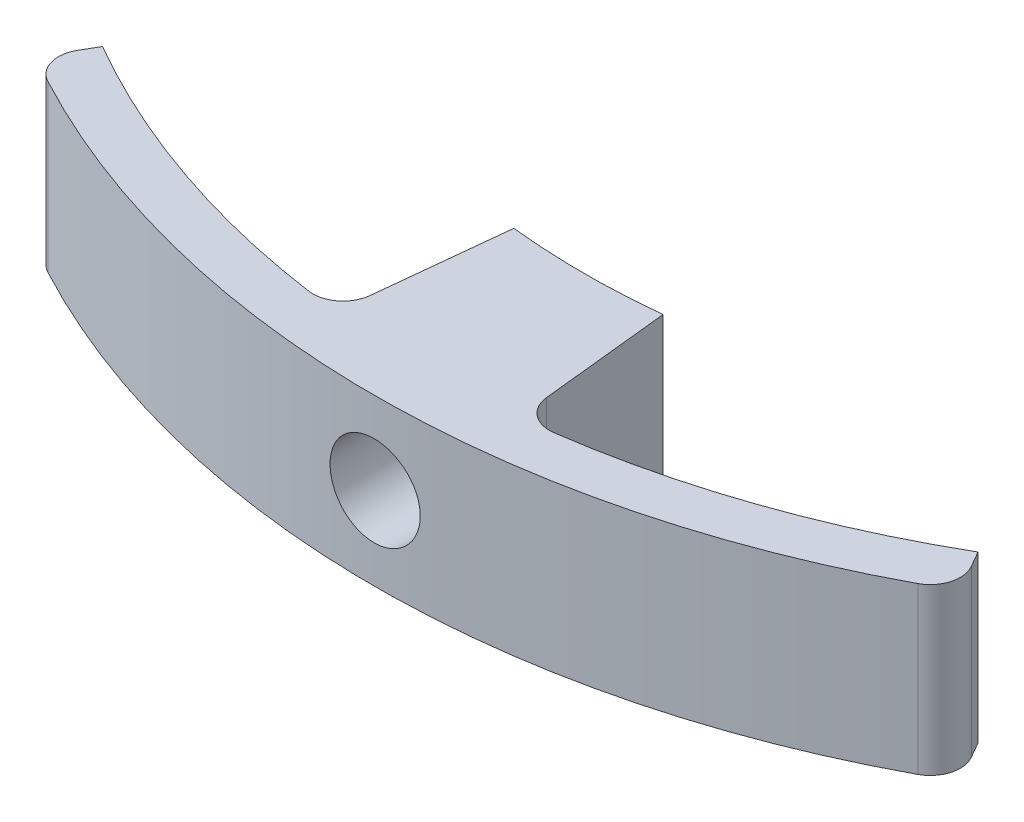
ISO-10303-21;
HEADER;
FILE_DESCRIPTION(('STEP AP214'),'2;1');
FILE_NAME('part.step','',(''),(''),'','','');
FILE_SCHEMA(('AUTOMOTIVE_DESIGN { 1 0 10303 214 1 1 1 1 }'));
ENDSEC;
DATA;
#1=APPLICATION_CONTEXT('core data for automotive mechanical design processes');
#2=APPLICATION_PROTOCOL_DEFINITION('international standard','automotive_design',2000,#1);
#3=PRODUCT_CONTEXT('',#1,'mechanical');
#4=PRODUCT('Part','Part','',(#3));
#5=PRODUCT_RELATED_PRODUCT_CATEGORY('part','',(#4));
#6=PRODUCT_DEFINITION_FORMATION('','',#4);
#7=PRODUCT_DEFINITION_CONTEXT('part definition',#1,'design');
#8=PRODUCT_DEFINITION('design','',#6,#7);
#9=PRODUCT_DEFINITION_SHAPE('','',#8);
#10=(LENGTH_UNIT() NAMED_UNIT(*) SI_UNIT(.MILLI.,.METRE.));
#11=(NAMED_UNIT(*) PLANE_ANGLE_UNIT() SI_UNIT($,.RADIAN.));
#12=(NAMED_UNIT(*) SI_UNIT($,.STERADIAN.) SOLID_ANGLE_UNIT());
#13=UNCERTAINTY_MEASURE_WITH_UNIT(LENGTH_MEASURE(1.E-05),#10,'distance_accuracy_value','');
#14=(GEOMETRIC_REPRESENTATION_CONTEXT(3) GLOBAL_UNCERTAINTY_ASSIGNED_CONTEXT((#13)) GLOBAL_UNIT_ASSIGNED_CONTEXT((#10,
#11,#12)) REPRESENTATION_CONTEXT('',''));
#15=CARTESIAN_POINT('',(0.,0.,0.));
#16=DIRECTION('',(0.,0.,1.));
#17=DIRECTION('',(1.,0.,0.));
#18=AXIS2_PLACEMENT_3D('',#15,#16,#17);
#19=CARTESIAN_POINT('',(13.,72.6735490003773,-57.2516853780901));
#20=DIRECTION('',(0.,-1.,0.));
#21=DIRECTION('',(1.,0.,0.));
#22=AXIS2_PLACEMENT_3D('',#19,#20,#21);
#23=CYLINDRICAL_SURFACE('',#22,47.5);
#24=CARTESIAN_POINT('',(14.5,5.49999999999999,-9.77537549621318));
#25=CARTESIAN_POINT('',(14.4999962715051,5.58423311771971,-9.7753751766498));
#26=CARTESIAN_POINT('',(14.4928809650694,5.66852677775698,-9.7751489167701));
#27=CARTESIAN_POINT('',(14.4645962000676,5.83479106022818,-9.7742681098958));
#28=CARTESIAN_POINT('',(14.4434099675749,5.91675878816941,-9.77361305174495));
#29=CARTESIAN_POINT('',(14.3875884628386,6.07593849288966,-9.77194892658279));
#30=CARTESIAN_POINT('',(14.3529597867884,6.1531527806802,-9.77094003322146));
#31=CARTESIAN_POINT('',(14.2712458769974,6.30065072529808,-9.76868214151818));
#32=CARTESIAN_POINT('',(14.2241636779302,6.37093606485115,-9.76743320169097));
#33=CARTESIAN_POINT('',(14.118852326546,6.50263699315104,-9.76483523385514));
#34=CARTESIAN_POINT('',(14.0606185431732,6.56404887825356,-9.76348616440751));
#35=CARTESIAN_POINT('',(13.9346652902813,6.67622843136156,-9.76084036395221));
#36=CARTESIAN_POINT('',(13.8669454426264,6.72699567484605,-9.75954363503361));
#37=CARTESIAN_POINT('',(13.723927946911,6.81645117120633,-9.75714846642311));
#38=CARTESIAN_POINT('',(13.6486288589682,6.85513712316403,-9.75605006451997));
#39=CARTESIAN_POINT('',(13.4926005960709,6.91931693681816,-9.75417570039046));
#40=CARTESIAN_POINT('',(13.4118714440589,6.94481085424799,-9.75339973680185));
#41=CARTESIAN_POINT('',(13.2473033689426,6.98187473985174,-9.75225794917248));
#42=CARTESIAN_POINT('',(13.1634654999875,6.99344938426308,-9.75189198739275));
#43=CARTESIAN_POINT('',(12.995035961426,7.00236057077915,-9.75161099368585));
#44=CARTESIAN_POINT('',(12.910444295006,6.99969717304268,-9.75169595985342));
#45=CARTESIAN_POINT('',(12.7429400870256,6.98021182124884,-9.75230712678476));
#46=CARTESIAN_POINT('',(12.6600269576975,6.9633949142738,-9.75283317026195));
#47=CARTESIAN_POINT('',(12.4982012561662,6.91608772329586,-9.75426702616968));
#48=CARTESIAN_POINT('',(12.4192886932428,6.88559740757704,-9.75517483948574));
#49=CARTESIAN_POINT('',(12.2676879314009,6.8118031218226,-9.75727019418966));
#50=CARTESIAN_POINT('',(12.1950008586076,6.76849683979978,-9.75845778604138));
#51=CARTESIAN_POINT('',(12.0579267495815,6.67030164670387,-9.76097886514691));
#52=CARTESIAN_POINT('',(11.993539734729,6.61541270579567,-9.76231235277651));
#53=CARTESIAN_POINT('',(11.8748640289177,6.49558172491615,-9.76497563782857));
#54=CARTESIAN_POINT('',(11.8205797598795,6.4306353055162,-9.76630543338536));
#55=CARTESIAN_POINT('',(11.7236845259669,6.29254840559263,-9.76881082630827));
#56=CARTESIAN_POINT('',(11.6810735630688,6.21940792368176,-9.76998642364828));
#57=CARTESIAN_POINT('',(11.6087349911771,6.06700660024199,-9.77205082079395));
#58=CARTESIAN_POINT('',(11.5790075268942,5.98774568997868,-9.77293961737815));
#59=CARTESIAN_POINT('',(11.5332826621532,5.82535457919406,-9.77433006015663));
#60=CARTESIAN_POINT('',(11.517285220272,5.74222439034707,-9.77483170751892));
#61=CARTESIAN_POINT('',(11.4994799388015,5.57449296818837,-9.77539107618823));
#62=CARTESIAN_POINT('',(11.4976659725275,5.48989238585607,-9.77544898917024));
#63=CARTESIAN_POINT('',(11.5082631671122,5.32158789861901,-9.77511485908235));
#64=CARTESIAN_POINT('',(11.5206743096336,5.2378839925585,-9.77472281659248));
#65=CARTESIAN_POINT('',(11.5593643389517,5.07376601905093,-9.77353314471295));
#66=CARTESIAN_POINT('',(11.585640440329,4.99335129431452,-9.77273559678902));
#67=CARTESIAN_POINT('',(11.6513116778774,4.83807418819995,-9.77082488992993));
#68=CARTESIAN_POINT('',(11.690706843469,4.76321181927388,-9.76971173028699));
#69=CARTESIAN_POINT('',(11.7815137068165,4.62113628305716,-9.76729481704044));
#70=CARTESIAN_POINT('',(11.8329295302098,4.55392575377488,-9.76599099805787));
#71=CARTESIAN_POINT('',(11.9463121446472,4.42908826181458,-9.76333997636345));
#72=CARTESIAN_POINT('',(12.008278965077,4.37146132582885,-9.76199277353078));
#73=CARTESIAN_POINT('',(12.1410308020256,4.26740639013537,-9.75940629508915));
#74=CARTESIAN_POINT('',(12.2118189166056,4.2209823418145,-9.75816705765901));
#75=CARTESIAN_POINT('',(12.3601881208689,4.14067801003974,-9.75593674639941));
#76=CARTESIAN_POINT('',(12.4377691943765,4.10679769671715,-9.75494567197904));
#77=CARTESIAN_POINT('',(12.5975071874769,4.05254950139883,-9.75332358763539));
#78=CARTESIAN_POINT('',(12.6796632376058,4.03217906131845,-9.75269250955024));
#79=CARTESIAN_POINT('',(12.8462313853929,4.00552046582288,-9.75186128509193));
#80=CARTESIAN_POINT('',(12.9306434804225,3.99923229400178,-9.75166113821672));
#81=CARTESIAN_POINT('',(13.0992880827844,4.00091702590551,-9.75171433321261));
#82=CARTESIAN_POINT('',(13.1835206524192,4.00888370645148,-9.75196747719252));
#83=CARTESIAN_POINT('',(13.3494520753302,4.03883919417666,-9.75289834300563));
#84=CARTESIAN_POINT('',(13.4311509236018,4.06082802905021,-9.75357606567738));
#85=CARTESIAN_POINT('',(13.5896980153248,4.11820273256798,-9.75527975703893));
#86=CARTESIAN_POINT('',(13.6665461794594,4.15358882021375,-9.75630573142148));
#87=CARTESIAN_POINT('',(13.8132094279404,4.23675155784624,-9.75859033784886));
#88=CARTESIAN_POINT('',(13.8830247641654,4.28452776386557,-9.75984896155685));
#89=CARTESIAN_POINT('',(14.0136695184439,4.39113344857887,-9.76245762494629));
#90=CARTESIAN_POINT('',(14.0744959644039,4.44996656859783,-9.7638076946493));
#91=CARTESIAN_POINT('',(14.1854253017483,4.57702662181964,-9.76644709771658));
#92=CARTESIAN_POINT('',(14.2355255351288,4.64525587656007,-9.76773641596477));
#93=CARTESIAN_POINT('',(14.3235897070501,4.78919975017933,-9.77010938938462));
#94=CARTESIAN_POINT('',(14.3615455268234,4.86491933239282,-9.77119290677873));
#95=CARTESIAN_POINT('',(14.4241615050792,5.02160127358229,-9.7730295993865));
#96=CARTESIAN_POINT('',(14.4488375091899,5.10255725458093,-9.77378316809759));
#97=CARTESIAN_POINT('',(14.4776580799256,5.23668676461988,-9.77467366620589));
#98=CARTESIAN_POINT('',(14.486025748504,5.28898979101596,-9.77493570799054));
#99=CARTESIAN_POINT('',(14.4971978788179,5.39418724676626,-9.77528672334652));
#100=CARTESIAN_POINT('',(14.5000023423768,5.44708167592662,-9.77537569697458));
#101=CARTESIAN_POINT('',(14.5,5.49999999999999,-9.77537549621318));
#102=B_SPLINE_CURVE_WITH_KNOTS('',3,(#24,#25,#26,#27,#28,#29,#30,#31,#32,#33,#34,#35,#36,#37,
#38,#39,#40,#41,#42,#43,#44,#45,#46,#47,#48,#49,#50,#51,#52,#53,#54,#55,#56,#57,#58,#59,#60,#61,
#62,#63,#64,#65,#66,#67,#68,#69,#70,#71,#72,#73,#74,#75,#76,#77,#78,#79,#80,#81,#82,#83,#84,#85,
#86,#87,#88,#89,#90,#91,#92,#93,#94,#95,#96,#97,#98,#99,#100,#101),.UNSPECIFIED.,.T.,.F.,(4,2,2,
2,2,2,2,2,2,2,2,2,2,2,2,2,2,2,2,2,2,2,2,2,2,2,2,2,2,2,2,2,2,2,2,2,2,2,4),(0.,0.252506193516446,
0.505313940817417,0.757997792104632,1.01062012604382,1.26334759797559,1.5160851470643,
1.76887080146104,2.02165538788637,2.27435502653707,2.52705359747839,2.77966209532541,
3.0322711791091,3.28492586112064,3.53758119393888,3.79034685396621,4.0431125567867,
4.29588109866188,4.54864887793898,4.80130746577851,5.05396572792091,5.30657325126038,
5.55918134109726,5.81187625674034,6.06457187617948,6.31735649441326,6.57014051072176,
6.82287664888499,7.07561249260895,7.32823802746451,7.58086406126769,7.83349422486396,
8.0861153373715,8.33881979073023,8.59158679310187,8.84452242358104,9.09715557541845,
9.2557892496884,9.41442287195915),.UNSPECIFIED.);
#103=CARTESIAN_POINT('',(14.5,5.49999999999999,-9.77537549621318));
#104=VERTEX_POINT('',#103);
#105=EDGE_CURVE('E212',#104,#104,#102,.T.);
#106=ORIENTED_EDGE('',*,*,#105,.T.);
#107=EDGE_LOOP('',(#106));
#108=FACE_BOUND('',#107,.T.);
#109=CARTESIAN_POINT('',(13.,11.,-57.2516853780901));
#110=DIRECTION('',(0.,1.,0.));
#111=DIRECTION('',(-1.,0.,0.));
#112=AXIS2_PLACEMENT_3D('',#109,#110,#111);
#113=CIRCLE('',#112,47.5);
#114=CARTESIAN_POINT('',(17.9651020052136,11.,-10.0118953480971));
#115=VERTEX_POINT('',#114);
#116=CARTESIAN_POINT('',(8.03489799478645,11.,-10.0118953480971));
#117=VERTEX_POINT('',#116);
#118=EDGE_CURVE('E179',#115,#117,#113,.F.);
#119=ORIENTED_EDGE('',*,*,#118,.F.);
#120=DIRECTION('',(0.,-1.,0.));
#121=VECTOR('',#120,1.);
#122=CARTESIAN_POINT('',(17.9651020052136,72.6735490003773,-10.0118953480971));
#123=LINE('',#122,#121);
#124=CARTESIAN_POINT('',(17.9651020052136,0.,-10.0118953480971));
#125=VERTEX_POINT('',#124);
#126=EDGE_CURVE('E60',#115,#125,#123,.T.);
#127=ORIENTED_EDGE('',*,*,#126,.T.);
#128=CARTESIAN_POINT('',(13.,0.,-57.2516853780901));
#129=DIRECTION('',(0.,-1.,0.));
#130=DIRECTION('',(-1.,0.,0.));
#131=AXIS2_PLACEMENT_3D('',#128,#129,#130);
#132=CIRCLE('',#131,47.5);
#133=CARTESIAN_POINT('',(8.03489799478645,0.,-10.0118953480971));
#134=VERTEX_POINT('',#133);
#135=EDGE_CURVE('E187',#125,#134,#132,.T.);
#136=ORIENTED_EDGE('',*,*,#135,.T.);
#137=DIRECTION('',(0.,-1.,0.));
#138=VECTOR('',#137,1.);
#139=CARTESIAN_POINT('',(8.03489799478645,72.6735490003773,-10.0118953480971));
#140=LINE('',#139,#138);
#141=EDGE_CURVE('E115',#117,#134,#140,.T.);
#142=ORIENTED_EDGE('',*,*,#141,.F.);
#143=EDGE_LOOP('',(#119,#127,#136,#142));
#144=FACE_BOUND('',#143,.T.);
#145=ADVANCED_FACE('F38',(#108,#144),#23,.F.);
#146=CARTESIAN_POINT('',(8.03489799478645,72.6735490003773,-10.0118953480971));
#147=DIRECTION('',(0.994521895368273,0.,0.104528463267659));
#148=DIRECTION('',(0.104528463267659,0.,-0.994521895368273));
#149=AXIS2_PLACEMENT_3D('',#146,#147,#148);
#150=PLANE('',#149);
#151=DIRECTION('',(-0.104528463267659,0.,0.994521895368273));
#152=VECTOR('',#151,1.);
#153=CARTESIAN_POINT('',(8.03489799478645,11.,-10.0118953480971));
#154=LINE('',#153,#152);
#155=CARTESIAN_POINT('',(7.12399168413925,11.,-1.34520072494867));
#156=VERTEX_POINT('',#155);
#157=EDGE_CURVE('E122',#117,#156,#154,.T.);
#158=ORIENTED_EDGE('',*,*,#157,.F.);
#159=ORIENTED_EDGE('',*,*,#141,.T.);
#160=DIRECTION('',(-0.104528463267659,0.,0.994521895368273));
#161=VECTOR('',#160,1.);
#162=CARTESIAN_POINT('',(8.03489799478645,0.,-10.0118953480971));
#163=LINE('',#162,#161);
#164=CARTESIAN_POINT('',(7.12399168413925,0.,-1.34520072494867));
#165=VERTEX_POINT('',#164);
#166=EDGE_CURVE('E186',#134,#165,#163,.T.);
#167=ORIENTED_EDGE('',*,*,#166,.T.);
#168=DIRECTION('',(0.,-1.,0.));
#169=VECTOR('',#168,1.);
#170=CARTESIAN_POINT('',(7.12399168413925,72.6735490003773,-1.34520072494867));
#171=LINE('',#170,#169);
#172=EDGE_CURVE('E188',#156,#165,#171,.T.);
#173=ORIENTED_EDGE('',*,*,#172,.F.);
#174=EDGE_LOOP('',(#158,#159,#167,#173));
#175=FACE_BOUND('',#174,.T.);
#176=ADVANCED_FACE('F277',(#175),#150,.F.);
#177=CARTESIAN_POINT('',(5.13494789340269,72.6735490003773,-1.55425765148398));
#178=DIRECTION('',(0.,-1.,0.));
#179=DIRECTION('',(1.,0.,0.));
#180=AXIS2_PLACEMENT_3D('',#177,#178,#179);
#181=CYLINDRICAL_SURFACE('',#180,2.00000000000001);
#182=CARTESIAN_POINT('',(5.1349478934027,11.,-1.55425765148398));
#183=DIRECTION('',(0.,1.,0.));
#184=DIRECTION('',(-1.,0.,0.));
#185=AXIS2_PLACEMENT_3D('',#182,#183,#184);
#186=CIRCLE('',#185,2.00000000000001);
#187=CARTESIAN_POINT('',(4.85530159627923,11.,0.426095334350916));
#188=VERTEX_POINT('',#187);
#189=EDGE_CURVE('E175',#156,#188,#186,.F.);
#190=ORIENTED_EDGE('',*,*,#189,.F.);
#191=ORIENTED_EDGE('',*,*,#172,.T.);
#192=CARTESIAN_POINT('',(5.1349478934027,0.,-1.55425765148398));
#193=DIRECTION('',(0.,-1.,0.));
#194=DIRECTION('',(1.,0.,0.));
#195=AXIS2_PLACEMENT_3D('',#192,#193,#194);
#196=CIRCLE('',#195,2.00000000000001);
#197=CARTESIAN_POINT('',(4.85530159627923,0.,0.426095334350916));
#198=VERTEX_POINT('',#197);
#199=EDGE_CURVE('E190',#165,#198,#196,.T.);
#200=ORIENTED_EDGE('',*,*,#199,.T.);
#201=DIRECTION('',(0.,-1.,0.));
#202=VECTOR('',#201,1.);
#203=CARTESIAN_POINT('',(4.85530159627923,72.6735490003773,0.426095334350917));
#204=LINE('',#203,#202);
#205=EDGE_CURVE('E191',#188,#198,#204,.T.);
#206=ORIENTED_EDGE('',*,*,#205,.F.);
#207=EDGE_LOOP('',(#190,#191,#200,#206));
#208=FACE_BOUND('',#207,.T.);
#209=ADVANCED_FACE('F274',(#208),#181,.F.);
#210=CARTESIAN_POINT('',(13.,72.6735490003773,-57.2516853780901));
#211=DIRECTION('',(0.,-1.,0.));
#212=DIRECTION('',(1.,0.,0.));
#213=AXIS2_PLACEMENT_3D('',#210,#211,#212);
#214=CYLINDRICAL_SURFACE('',#213,58.25);
#215=CARTESIAN_POINT('',(13.,11.,-57.2516853780901));
#216=DIRECTION('',(0.,1.,0.));
#217=DIRECTION('',(-1.,0.,0.));
#218=AXIS2_PLACEMENT_3D('',#215,#216,#217);
#219=CIRCLE('',#218,58.25);
#220=CARTESIAN_POINT('',(-16.1250000000001,11.,-6.80570560764654));
#221=VERTEX_POINT('',#220);
#222=EDGE_CURVE('E172',#188,#221,#219,.F.);
#223=ORIENTED_EDGE('',*,*,#222,.F.);
#224=ORIENTED_EDGE('',*,*,#205,.T.);
#225=CARTESIAN_POINT('',(13.,0.,-57.2516853780901));
#226=DIRECTION('',(0.,-1.,0.));
#227=DIRECTION('',(-1.,0.,0.));
#228=AXIS2_PLACEMENT_3D('',#225,#226,#227);
#229=CIRCLE('',#228,58.25);
#230=CARTESIAN_POINT('',(-16.1250000000001,0.,-6.80570560764654));
#231=VERTEX_POINT('',#230);
#232=EDGE_CURVE('E193',#198,#231,#229,.T.);
#233=ORIENTED_EDGE('',*,*,#232,.T.);
#234=DIRECTION('',(0.,-1.,0.));
#235=VECTOR('',#234,1.);
#236=CARTESIAN_POINT('',(-16.1250000000001,72.6735490003773,-6.80570560764654));
#237=LINE('',#236,#235);
#238=EDGE_CURVE('E194',#221,#231,#237,.T.);
#239=ORIENTED_EDGE('',*,*,#238,.F.);
#240=EDGE_LOOP('',(#223,#224,#233,#239));
#241=FACE_BOUND('',#240,.T.);
#242=ADVANCED_FACE('F270',(#241),#214,.F.);
#243=CARTESIAN_POINT('',(-16.1250000000001,72.6735490003773,-6.80570560764654));
#244=DIRECTION('',(0.866025403784436,0.,0.500000000000004));
#245=DIRECTION('',(0.500000000000004,0.,-0.866025403784436));
#246=AXIS2_PLACEMENT_3D('',#243,#244,#245);
#247=PLANE('',#246);
#248=DIRECTION('',(-0.500000000000004,0.,0.866025403784436));
#249=VECTOR('',#248,1.);
#250=CARTESIAN_POINT('',(-16.1250000000001,11.,-6.80570560764654));
#251=LINE('',#250,#249);
#252=CARTESIAN_POINT('',(-16.7331885273007,11.,-5.75229217778142));
#253=VERTEX_POINT('',#252);
#254=EDGE_CURVE('E169',#221,#253,#251,.T.);
#255=ORIENTED_EDGE('',*,*,#254,.F.);
#256=ORIENTED_EDGE('',*,*,#238,.T.);
#257=DIRECTION('',(-0.500000000000004,0.,0.866025403784436));
#258=VECTOR('',#257,1.);
#259=CARTESIAN_POINT('',(-16.1250000000001,0.,-6.80570560764654));
#260=LINE('',#259,#258);
#261=CARTESIAN_POINT('',(-16.7331885273007,0.,-5.75229217778142));
#262=VERTEX_POINT('',#261);
#263=EDGE_CURVE('E196',#231,#262,#260,.T.);
#264=ORIENTED_EDGE('',*,*,#263,.T.);
#265=DIRECTION('',(0.,-1.,0.));
#266=VECTOR('',#265,1.);
#267=CARTESIAN_POINT('',(-16.7331885273007,72.6735490003773,-5.75229217778142));
#268=LINE('',#267,#266);
#269=EDGE_CURVE('E197',#253,#262,#268,.T.);
#270=ORIENTED_EDGE('',*,*,#269,.F.);
#271=EDGE_LOOP('',(#255,#256,#264,#270));
#272=FACE_BOUND('',#271,.T.);
#273=ADVANCED_FACE('F266',(#272),#247,.F.);
#274=CARTESIAN_POINT('',(-15.0011377197318,72.6735490003773,-4.75229217778141));
#275=DIRECTION('',(0.,-1.,0.));
#276=DIRECTION('',(1.,0.,0.));
#277=AXIS2_PLACEMENT_3D('',#274,#275,#276);
#278=CYLINDRICAL_SURFACE('',#277,2.);
#279=CARTESIAN_POINT('',(-15.0011377197318,11.,-4.75229217778141));
#280=DIRECTION('',(0.,1.,0.));
#281=DIRECTION('',(-1.,0.,0.));
#282=AXIS2_PLACEMENT_3D('',#279,#280,#281);
#283=CIRCLE('',#282,2.);
#284=CARTESIAN_POINT('',(-15.9423524330001,11.,-2.98760669205676));
#285=VERTEX_POINT('',#284);
#286=EDGE_CURVE('E166',#253,#285,#283,.T.);
#287=ORIENTED_EDGE('',*,*,#286,.F.);
#288=ORIENTED_EDGE('',*,*,#269,.T.);
#289=CARTESIAN_POINT('',(-15.0011377197318,0.,-4.75229217778141));
#290=DIRECTION('',(0.,1.,0.));
#291=DIRECTION('',(1.,0.,0.));
#292=AXIS2_PLACEMENT_3D('',#289,#290,#291);
#293=CIRCLE('',#292,2.);
#294=CARTESIAN_POINT('',(-15.9423524330001,0.,-2.98760669205676));
#295=VERTEX_POINT('',#294);
#296=EDGE_CURVE('E199',#262,#295,#293,.T.);
#297=ORIENTED_EDGE('',*,*,#296,.T.);
#298=DIRECTION('',(0.,-1.,0.));
#299=VECTOR('',#298,1.);
#300=CARTESIAN_POINT('',(-15.9423524330001,72.6735490003773,-2.98760669205676));
#301=LINE('',#300,#299);
#302=EDGE_CURVE('E200',#285,#295,#301,.T.);
#303=ORIENTED_EDGE('',*,*,#302,.F.);
#304=EDGE_LOOP('',(#287,#288,#297,#303));
#305=FACE_BOUND('',#304,.T.);
#306=ADVANCED_FACE('F262',(#305),#278,.T.);
#307=CARTESIAN_POINT('',(13.,72.6735490003773,-57.2516853780901));
#308=DIRECTION('',(0.,-1.,0.));
#309=DIRECTION('',(1.,0.,0.));
#310=AXIS2_PLACEMENT_3D('',#307,#308,#309);
#311=CYLINDRICAL_SURFACE('',#310,61.5);
#312=CARTESIAN_POINT('',(16.,5.49999999999999,4.17510031023974));
#313=CARTESIAN_POINT('',(15.9999925658783,5.33159627434654,4.17510129407778));
#314=CARTESIAN_POINT('',(15.9857724690886,5.16307299203059,4.17580028064913));
#315=CARTESIAN_POINT('',(15.9292471475351,4.83067502855951,4.1785212055901));
#316=CARTESIAN_POINT('',(15.8869087970806,4.66680606831218,4.18054470430696));
#317=CARTESIAN_POINT('',(15.7753617307674,4.34857999204211,4.18568489894659));
#318=CARTESIAN_POINT('',(15.7061666711148,4.19421808798067,4.18880103920099));
#319=CARTESIAN_POINT('',(15.5428912430399,3.89934233530041,4.19577468853107));
#320=CARTESIAN_POINT('',(15.4488167638026,3.75882522028384,4.19963202210053));
#321=CARTESIAN_POINT('',(15.2383510565605,3.49544950395598,4.20765769417617));
#322=CARTESIAN_POINT('',(15.1219409670305,3.37260598180322,4.21182629370354));
#323=CARTESIAN_POINT('',(14.8701460053548,3.14819301745987,4.22000230989873));
#324=CARTESIAN_POINT('',(14.7347603604952,3.04662444203851,4.22400971999413));
#325=CARTESIAN_POINT('',(14.4487795108301,2.86760384721628,4.23141373498594));
#326=CARTESIAN_POINT('',(14.2981770256853,2.79016344473618,4.23481004532649));
#327=CARTESIAN_POINT('',(13.9860888334065,2.66167204030995,4.24060651358651));
#328=CARTESIAN_POINT('',(13.8246032057249,2.61062084573257,4.24300667877743));
#329=CARTESIAN_POINT('',(13.4954702725893,2.5363964932403,4.24653864581846));
#330=CARTESIAN_POINT('',(13.3278280235176,2.51320096301366,4.24767146548863));
#331=CARTESIAN_POINT('',(12.9910257489741,2.49527733780398,4.24854449418959));
#332=CARTESIAN_POINT('',(12.8218657350131,2.5005490271059,4.24828471377305));
#333=CARTESIAN_POINT('',(12.4869812514128,2.53939161649015,4.24640267535901));
#334=CARTESIAN_POINT('',(12.3212539809665,2.57293843314316,4.24478157687281));
#335=CARTESIAN_POINT('',(11.997785936648,2.66734167771043,4.24036084279189));
#336=CARTESIAN_POINT('',(11.8400451950748,2.72819821606053,4.23756120243134));
#337=CARTESIAN_POINT('',(11.5369503341277,2.87552088395497,4.23109676163692));
#338=CARTESIAN_POINT('',(11.3916015588995,2.9619979913732,4.22743159047821));
#339=CARTESIAN_POINT('',(11.1174749699192,3.1580990056603,4.21964886574205));
#340=CARTESIAN_POINT('',(10.988697267244,3.2677230676714,4.21553130913256));
#341=CARTESIAN_POINT('',(10.7512278973575,3.50714232771663,4.20730247417259));
#342=CARTESIAN_POINT('',(10.6425572944817,3.63695842001667,4.203191206831));
#343=CARTESIAN_POINT('',(10.4485491462017,3.91300331594905,4.19544275640609));
#344=CARTESIAN_POINT('',(10.3632116067774,4.05923212378758,4.19180557344428));
#345=CARTESIAN_POINT('',(10.2182938766642,4.36396420227138,4.18541577985263));
#346=CARTESIAN_POINT('',(10.1587144698653,4.52246784630023,4.18266319614421));
#347=CARTESIAN_POINT('',(10.0670182759568,4.84724454798861,4.17835404403034));
#348=CARTESIAN_POINT('',(10.0349012922466,5.01351755001914,4.1767974670628));
#349=CARTESIAN_POINT('',(9.99906766457482,5.34892961155995,4.17505744330145));
#350=CARTESIAN_POINT('',(9.99532178815667,5.51806554102624,4.17487258314936));
#351=CARTESIAN_POINT('',(10.0162604291543,5.85456357750165,4.1758931498639));
#352=CARTESIAN_POINT('',(10.0409448571598,6.02192569008755,4.17709857235822));
#353=CARTESIAN_POINT('',(10.1180191643688,6.35004322519239,4.18076255000737));
#354=CARTESIAN_POINT('',(10.1703956706354,6.51080179631596,4.18322050027627));
#355=CARTESIAN_POINT('',(10.3013538225592,6.82124587343914,4.18911198210219));
#356=CARTESIAN_POINT('',(10.3799356124557,6.97093131848442,4.19254551902902));
#357=CARTESIAN_POINT('',(10.5611487334963,7.25511462419331,4.20000461869047));
#358=CARTESIAN_POINT('',(10.6637997048848,7.38959994815779,4.20403066390238));
#359=CARTESIAN_POINT('',(10.8902086005065,7.63943937300478,4.21221929961324));
#360=CARTESIAN_POINT('',(11.0139666535578,7.75479335711884,4.2163818909454));
#361=CARTESIAN_POINT('',(11.2792022058821,7.96319381062553,4.2243785786114));
#362=CARTESIAN_POINT('',(11.4206945488364,8.05622140034156,4.22821239517816));
#363=CARTESIAN_POINT('',(11.7173071606572,8.21719929074128,4.23511545356911));
#364=CARTESIAN_POINT('',(11.8724273723443,8.28514969663666,4.23818469860106));
#365=CARTESIAN_POINT('',(12.1918221246893,8.39401133260936,4.24321136621277));
#366=CARTESIAN_POINT('',(12.3560925367336,8.43493465197722,4.2451692858363));
#367=CARTESIAN_POINT('',(12.6891825052107,8.48862004553927,4.24775461865923));
#368=CARTESIAN_POINT('',(12.8580020376058,8.50138226850855,4.24838203888766));
#369=CARTESIAN_POINT('',(13.1952106282891,8.49838176371254,4.24823569452635));
#370=CARTESIAN_POINT('',(13.3635999515901,8.48264865763293,4.24746338499398));
#371=CARTESIAN_POINT('',(13.6953435428242,8.42316531468603,4.24460739499377));
#372=CARTESIAN_POINT('',(13.8586978012275,8.37941502479352,4.24252371204402));
#373=CARTESIAN_POINT('',(14.1757406363045,8.26514520997241,4.23727942253321));
#374=CARTESIAN_POINT('',(14.3294291326079,8.1946254624912,4.2341188070189));
#375=CARTESIAN_POINT('',(14.6227865713065,8.02882382295192,4.22707615575422));
#376=CARTESIAN_POINT('',(14.7624559496187,7.93354270116643,4.22319414244603));
#377=CARTESIAN_POINT('',(15.0239580672739,7.72081750403985,4.21514108013865));
#378=CARTESIAN_POINT('',(15.1457740956302,7.60335289699414,4.21096976566091));
#379=CARTESIAN_POINT('',(15.3679951508582,7.3496063981365,4.20280997885374));
#380=CARTESIAN_POINT('',(15.4683948999408,7.21331988148827,4.19882155178442));
#381=CARTESIAN_POINT('',(15.6449782473513,6.92569510806956,4.19147479946861));
#382=CARTESIAN_POINT('',(15.7211390901997,6.77434288154132,4.1881170675231));
#383=CARTESIAN_POINT('',(15.8468775691131,6.46109680548081,4.18241986473059));
#384=CARTESIAN_POINT('',(15.8964866273999,6.29921567189273,4.18007919088515));
#385=CARTESIAN_POINT('',(15.9546905658035,6.03027289278288,4.17730025729495));
#386=CARTESIAN_POINT('',(15.971659934627,5.92495353527667,4.17647891140821));
#387=CARTESIAN_POINT('',(15.9943169995338,5.71310541267513,4.17537862678324));
#388=CARTESIAN_POINT('',(16.0000047047877,5.60657664856295,4.17509968760411));
#389=CARTESIAN_POINT('',(16.,5.49999999999999,4.17510031023974));
#390=B_SPLINE_CURVE_WITH_KNOTS('',3,(#312,#313,#314,#315,#316,#317,#318,#319,#320,#321,#322,
#323,#324,#325,#326,#327,#328,#329,#330,#331,#332,#333,#334,#335,#336,#337,#338,#339,#340,#341,
#342,#343,#344,#345,#346,#347,#348,#349,#350,#351,#352,#353,#354,#355,#356,#357,#358,#359,#360,
#361,#362,#363,#364,#365,#366,#367,#368,#369,#370,#371,#372,#373,#374,#375,#376,#377,#378,#379,
#380,#381,#382,#383,#384,#385,#386,#387,#388,#389),.UNSPECIFIED.,.T.,.F.,(4,2,2,2,2,2,2,2,2,2,2,
2,2,2,2,2,2,2,2,2,2,2,2,2,2,2,2,2,2,2,2,2,2,2,2,2,2,2,4),(0.,0.504822133199071,1.01024004721127,
1.51540130029482,2.02044308397236,2.52591324728288,3.03140400010693,3.53713775533275,
4.04286781884113,4.5481914323854,5.05351121676254,5.55840102785537,6.06329288065446,
6.56840138261928,7.07351327017614,7.57915135686929,8.08478957314589,8.59044317628476,
9.09609315947259,9.60122207012998,10.1063493922146,10.6112330029351,11.1161193926857,
11.6214192079782,12.1267221072629,12.632450807697,13.1381773863149,13.6436775985479,
14.1491751402167,14.6541475047241,15.1591208249428,15.6640983434381,16.1690601550596,
16.6744916401114,17.1800475392464,17.6860766636129,18.1915056055048,18.5109895991168,
18.8304733330306),.UNSPECIFIED.);
#391=CARTESIAN_POINT('',(16.,5.49999999999999,4.17510031023974));
#392=VERTEX_POINT('',#391);
#393=EDGE_CURVE('E42',#392,#392,#390,.T.);
#394=ORIENTED_EDGE('',*,*,#393,.T.);
#395=EDGE_LOOP('',(#394));
#396=FACE_BOUND('',#395,.T.);
#397=CARTESIAN_POINT('',(13.,11.,-57.2516853780901));
#398=DIRECTION('',(0.,1.,0.));
#399=DIRECTION('',(-1.,0.,0.));
#400=AXIS2_PLACEMENT_3D('',#397,#398,#399);
#401=CIRCLE('',#400,61.5);
#402=CARTESIAN_POINT('',(41.9423524330001,11.,-2.98760669205675));
#403=VERTEX_POINT('',#402);
#404=EDGE_CURVE('E163',#285,#403,#401,.T.);
#405=ORIENTED_EDGE('',*,*,#404,.F.);
#406=ORIENTED_EDGE('',*,*,#302,.T.);
#407=CARTESIAN_POINT('',(13.,0.,-57.2516853780901));
#408=DIRECTION('',(0.,1.,0.));
#409=DIRECTION('',(-1.,0.,0.));
#410=AXIS2_PLACEMENT_3D('',#407,#408,#409);
#411=CIRCLE('',#410,61.5);
#412=CARTESIAN_POINT('',(41.9423524330001,0.,-2.98760669205675));
#413=VERTEX_POINT('',#412);
#414=EDGE_CURVE('E202',#295,#413,#411,.T.);
#415=ORIENTED_EDGE('',*,*,#414,.T.);
#416=DIRECTION('',(0.,-1.,0.));
#417=VECTOR('',#416,1.);
#418=CARTESIAN_POINT('',(41.9423524330001,72.6735490003773,-2.98760669205675));
#419=LINE('',#418,#417);
#420=EDGE_CURVE('E203',#403,#413,#419,.T.);
#421=ORIENTED_EDGE('',*,*,#420,.F.);
#422=EDGE_LOOP('',(#405,#406,#415,#421));
#423=FACE_BOUND('',#422,.T.);
#424=ADVANCED_FACE('F257',(#396,#423),#311,.T.);
#425=CARTESIAN_POINT('',(41.0011377197318,72.6735490003773,-4.75229217778142));
#426=DIRECTION('',(0.,-1.,0.));
#427=DIRECTION('',(1.,0.,0.));
#428=AXIS2_PLACEMENT_3D('',#425,#426,#427);
#429=CYLINDRICAL_SURFACE('',#428,2.00000000000001);
#430=CARTESIAN_POINT('',(41.0011377197318,11.,-4.75229217778142));
#431=DIRECTION('',(0.,1.,0.));
#432=DIRECTION('',(-1.,0.,0.));
#433=AXIS2_PLACEMENT_3D('',#430,#431,#432);
#434=CIRCLE('',#433,2.00000000000001);
#435=CARTESIAN_POINT('',(42.7331885273007,11.,-5.75229217778142));
#436=VERTEX_POINT('',#435);
#437=EDGE_CURVE('E158',#403,#436,#434,.T.);
#438=ORIENTED_EDGE('',*,*,#437,.F.);
#439=ORIENTED_EDGE('',*,*,#420,.T.);
#440=CARTESIAN_POINT('',(41.0011377197318,0.,-4.75229217778142));
#441=DIRECTION('',(0.,1.,0.));
#442=DIRECTION('',(1.,0.,0.));
#443=AXIS2_PLACEMENT_3D('',#440,#441,#442);
#444=CIRCLE('',#443,2.00000000000001);
#445=CARTESIAN_POINT('',(42.7331885273007,0.,-5.75229217778142));
#446=VERTEX_POINT('',#445);
#447=EDGE_CURVE('E205',#413,#446,#444,.T.);
#448=ORIENTED_EDGE('',*,*,#447,.T.);
#449=DIRECTION('',(0.,-1.,0.));
#450=VECTOR('',#449,1.);
#451=CARTESIAN_POINT('',(42.7331885273007,72.6735490003773,-5.75229217778142));
#452=LINE('',#451,#450);
#453=EDGE_CURVE('E206',#436,#446,#452,.T.);
#454=ORIENTED_EDGE('',*,*,#453,.F.);
#455=EDGE_LOOP('',(#438,#439,#448,#454));
#456=FACE_BOUND('',#455,.T.);
#457=ADVANCED_FACE('F254',(#456),#429,.T.);
#458=CARTESIAN_POINT('',(42.125,72.6735490003773,-6.80570560764653));
#459=DIRECTION('',(-0.866025403784433,0.,0.500000000000008));
#460=DIRECTION('',(0.500000000000009,0.,0.866025403784434));
#461=AXIS2_PLACEMENT_3D('',#458,#459,#460);
#462=PLANE('',#461);
#463=DIRECTION('',(-0.500000000000009,0.,-0.866025403784434));
#464=VECTOR('',#463,1.);
#465=CARTESIAN_POINT('',(42.125,11.,-6.80570560764653));
#466=LINE('',#465,#464);
#467=CARTESIAN_POINT('',(42.125,11.,-6.80570560764655));
#468=VERTEX_POINT('',#467);
#469=EDGE_CURVE('E156',#436,#468,#466,.T.);
#470=ORIENTED_EDGE('',*,*,#469,.F.);
#471=ORIENTED_EDGE('',*,*,#453,.T.);
#472=DIRECTION('',(-0.500000000000009,0.,-0.866025403784434));
#473=VECTOR('',#472,1.);
#474=CARTESIAN_POINT('',(42.125,0.,-6.80570560764653));
#475=LINE('',#474,#473);
#476=CARTESIAN_POINT('',(42.125,0.,-6.80570560764655));
#477=VERTEX_POINT('',#476);
#478=EDGE_CURVE('E208',#446,#477,#475,.T.);
#479=ORIENTED_EDGE('',*,*,#478,.T.);
#480=DIRECTION('',(0.,-1.,0.));
#481=VECTOR('',#480,1.);
#482=CARTESIAN_POINT('',(42.125,72.6735490003773,-6.80570560764655));
#483=LINE('',#482,#481);
#484=EDGE_CURVE('E209',#468,#477,#483,.T.);
#485=ORIENTED_EDGE('',*,*,#484,.F.);
#486=EDGE_LOOP('',(#470,#471,#479,#485));
#487=FACE_BOUND('',#486,.T.);
#488=ADVANCED_FACE('F251',(#487),#462,.F.);
#489=CARTESIAN_POINT('',(13.,72.6735490003773,-57.2516853780901));
#490=DIRECTION('',(0.,-1.,0.));
#491=DIRECTION('',(1.,0.,0.));
#492=AXIS2_PLACEMENT_3D('',#489,#490,#491);
#493=CYLINDRICAL_SURFACE('',#492,58.25);
#494=CARTESIAN_POINT('',(13.,11.,-57.2516853780901));
#495=DIRECTION('',(0.,1.,0.));
#496=DIRECTION('',(-1.,0.,0.));
#497=AXIS2_PLACEMENT_3D('',#494,#495,#496);
#498=CIRCLE('',#497,58.25);
#499=CARTESIAN_POINT('',(21.1446984037208,11.,0.426095334350903));
#500=VERTEX_POINT('',#499);
#501=EDGE_CURVE('E52',#468,#500,#498,.F.);
#502=ORIENTED_EDGE('',*,*,#501,.F.);
#503=ORIENTED_EDGE('',*,*,#484,.T.);
#504=CARTESIAN_POINT('',(13.,0.,-57.2516853780901));
#505=DIRECTION('',(0.,-1.,0.));
#506=DIRECTION('',(-1.,0.,0.));
#507=AXIS2_PLACEMENT_3D('',#504,#505,#506);
#508=CIRCLE('',#507,58.25);
#509=CARTESIAN_POINT('',(21.1446984037208,0.,0.426095334350903));
#510=VERTEX_POINT('',#509);
#511=EDGE_CURVE('E150',#477,#510,#508,.T.);
#512=ORIENTED_EDGE('',*,*,#511,.T.);
#513=DIRECTION('',(0.,-1.,0.));
#514=VECTOR('',#513,1.);
#515=CARTESIAN_POINT('',(21.1446984037208,72.6735490003773,0.426095334350903));
#516=LINE('',#515,#514);
#517=EDGE_CURVE('E141',#500,#510,#516,.T.);
#518=ORIENTED_EDGE('',*,*,#517,.F.);
#519=EDGE_LOOP('',(#502,#503,#512,#518));
#520=FACE_BOUND('',#519,.T.);
#521=ADVANCED_FACE('F147',(#520),#493,.F.);
#522=CARTESIAN_POINT('',(20.8650521065973,72.6735490003773,-1.55425765148399));
#523=DIRECTION('',(0.,-1.,0.));
#524=DIRECTION('',(1.,0.,0.));
#525=AXIS2_PLACEMENT_3D('',#522,#523,#524);
#526=CYLINDRICAL_SURFACE('',#525,2.);
#527=CARTESIAN_POINT('',(20.8650521065973,11.,-1.55425765148399));
#528=DIRECTION('',(0.,1.,0.));
#529=DIRECTION('',(-1.,0.,0.));
#530=AXIS2_PLACEMENT_3D('',#527,#528,#529);
#531=CIRCLE('',#530,2.);
#532=CARTESIAN_POINT('',(18.8760083158608,11.,-1.34520072494868));
#533=VERTEX_POINT('',#532);
#534=EDGE_CURVE('E11',#500,#533,#531,.F.);
#535=ORIENTED_EDGE('',*,*,#534,.F.);
#536=ORIENTED_EDGE('',*,*,#517,.T.);
#537=CARTESIAN_POINT('',(20.8650521065973,0.,-1.55425765148399));
#538=DIRECTION('',(0.,-1.,0.));
#539=DIRECTION('',(1.,0.,0.));
#540=AXIS2_PLACEMENT_3D('',#537,#538,#539);
#541=CIRCLE('',#540,2.);
#542=CARTESIAN_POINT('',(18.8760083158608,0.,-1.34520072494868));
#543=VERTEX_POINT('',#542);
#544=EDGE_CURVE('E152',#510,#543,#541,.T.);
#545=ORIENTED_EDGE('',*,*,#544,.T.);
#546=DIRECTION('',(0.,-1.,0.));
#547=VECTOR('',#546,1.);
#548=CARTESIAN_POINT('',(18.8760083158608,72.6735490003773,-1.34520072494868));
#549=LINE('',#548,#547);
#550=EDGE_CURVE('E66',#533,#543,#549,.T.);
#551=ORIENTED_EDGE('',*,*,#550,.F.);
#552=EDGE_LOOP('',(#535,#536,#545,#551));
#553=FACE_BOUND('',#552,.T.);
#554=ADVANCED_FACE('F140',(#553),#526,.F.);
#555=CARTESIAN_POINT('',(17.9651020052136,72.6735490003773,-10.0118953480971));
#556=DIRECTION('',(-0.994521895368273,0.,0.104528463267653));
#557=DIRECTION('',(0.104528463267653,0.,0.994521895368273));
#558=AXIS2_PLACEMENT_3D('',#555,#556,#557);
#559=PLANE('',#558);
#560=DIRECTION('',(-0.104528463267653,0.,-0.994521895368273));
#561=VECTOR('',#560,1.);
#562=CARTESIAN_POINT('',(17.9651020052136,11.,-10.0118953480971));
#563=LINE('',#562,#561);
#564=EDGE_CURVE('E182',#533,#115,#563,.T.);
#565=ORIENTED_EDGE('',*,*,#564,.F.);
#566=ORIENTED_EDGE('',*,*,#550,.T.);
#567=DIRECTION('',(-0.104528463267653,0.,-0.994521895368273));
#568=VECTOR('',#567,1.);
#569=CARTESIAN_POINT('',(17.9651020052136,0.,-10.0118953480971));
#570=LINE('',#569,#568);
#571=EDGE_CURVE('E184',#543,#125,#570,.T.);
#572=ORIENTED_EDGE('',*,*,#571,.T.);
#573=ORIENTED_EDGE('',*,*,#126,.F.);
#574=EDGE_LOOP('',(#565,#566,#572,#573));
#575=FACE_BOUND('',#574,.T.);
#576=ADVANCED_FACE('F243',(#575),#559,.F.);
#577=CARTESIAN_POINT('',(13.,0.,-57.2516853780901));
#578=DIRECTION('',(0.,1.,0.));
#579=DIRECTION('',(-1.,0.,0.));
#580=AXIS2_PLACEMENT_3D('',#577,#578,#579);
#581=PLANE('',#580);
#582=ORIENTED_EDGE('',*,*,#135,.F.);
#583=ORIENTED_EDGE('',*,*,#571,.F.);
#584=ORIENTED_EDGE('',*,*,#544,.F.);
#585=ORIENTED_EDGE('',*,*,#511,.F.);
#586=ORIENTED_EDGE('',*,*,#478,.F.);
#587=ORIENTED_EDGE('',*,*,#447,.F.);
#588=ORIENTED_EDGE('',*,*,#414,.F.);
#589=ORIENTED_EDGE('',*,*,#296,.F.);
#590=ORIENTED_EDGE('',*,*,#263,.F.);
#591=ORIENTED_EDGE('',*,*,#232,.F.);
#592=ORIENTED_EDGE('',*,*,#199,.F.);
#593=ORIENTED_EDGE('',*,*,#166,.F.);
#594=EDGE_LOOP('',(#582,#583,#584,#585,#586,#587,#588,#589,#590,#591,#592,#593));
#595=FACE_BOUND('',#594,.T.);
#596=ADVANCED_FACE('F240',(#595),#581,.F.);
#597=CARTESIAN_POINT('',(13.,11.,13.322));
#598=DIRECTION('',(0.,1.,0.));
#599=DIRECTION('',(-1.,0.,0.));
#600=AXIS2_PLACEMENT_3D('',#597,#598,#599);
#601=PLANE('',#600);
#602=ORIENTED_EDGE('',*,*,#564,.T.);
#603=ORIENTED_EDGE('',*,*,#118,.T.);
#604=ORIENTED_EDGE('',*,*,#157,.T.);
#605=ORIENTED_EDGE('',*,*,#189,.T.);
#606=ORIENTED_EDGE('',*,*,#222,.T.);
#607=ORIENTED_EDGE('',*,*,#254,.T.);
#608=ORIENTED_EDGE('',*,*,#286,.T.);
#609=ORIENTED_EDGE('',*,*,#404,.T.);
#610=ORIENTED_EDGE('',*,*,#437,.T.);
#611=ORIENTED_EDGE('',*,*,#469,.T.);
#612=ORIENTED_EDGE('',*,*,#501,.T.);
#613=ORIENTED_EDGE('',*,*,#534,.T.);
#614=EDGE_LOOP('',(#602,#603,#604,#605,#606,#607,#608,#609,#610,#611,#612,#613));
#615=FACE_BOUND('',#614,.T.);
#616=ADVANCED_FACE('F40',(#615),#601,.T.);
#617=CARTESIAN_POINT('',(13.,5.49999999999999,-119.25168537809));
#618=DIRECTION('',(0.,0.,1.));
#619=DIRECTION('',(1.,0.,0.));
#620=AXIS2_PLACEMENT_3D('',#617,#618,#619);
#621=CYLINDRICAL_SURFACE('',#620,1.50000000000001);
#622=CARTESIAN_POINT('',(13.,5.49999999999999,-5.12226025840137));
#623=DIRECTION('',(0.,0.,-1.));
#624=DIRECTION('',(-1.,0.,0.));
#625=AXIS2_PLACEMENT_3D('',#622,#623,#624);
#626=CIRCLE('',#625,1.50000000000001);
#627=CARTESIAN_POINT('',(11.5,5.49999999999999,-5.12226025840137));
#628=VERTEX_POINT('',#627);
#629=EDGE_CURVE('E213',#628,#628,#626,.F.);
#630=ORIENTED_EDGE('',*,*,#629,.T.);
#631=EDGE_LOOP('',(#630));
#632=FACE_BOUND('',#631,.T.);
#633=ORIENTED_EDGE('',*,*,#105,.F.);
#634=EDGE_LOOP('',(#633));
#635=FACE_BOUND('',#634,.T.);
#636=ADVANCED_FACE('F233',(#632,#635),#621,.F.);
#637=CARTESIAN_POINT('',(13.,5.49999999999999,-28.6075416326399));
#638=DIRECTION('',(0.,0.,1.));
#639=DIRECTION('',(1.,0.,0.));
#640=AXIS2_PLACEMENT_3D('',#637,#638,#639);
#641=CYLINDRICAL_SURFACE('',#640,3.);
#642=CARTESIAN_POINT('',(13.,5.49999999999999,-5.12226025840137));
#643=DIRECTION('',(0.,0.,-1.));
#644=DIRECTION('',(-1.,0.,0.));
#645=AXIS2_PLACEMENT_3D('',#642,#643,#644);
#646=CIRCLE('',#645,3.);
#647=CARTESIAN_POINT('',(10.,5.49999999999999,-5.12226025840137));
#648=VERTEX_POINT('',#647);
#649=EDGE_CURVE('E215',#648,#648,#646,.F.);
#650=ORIENTED_EDGE('',*,*,#649,.F.);
#651=EDGE_LOOP('',(#650));
#652=FACE_BOUND('',#651,.T.);
#653=ORIENTED_EDGE('',*,*,#393,.F.);
#654=EDGE_LOOP('',(#653));
#655=FACE_BOUND('',#654,.T.);
#656=ADVANCED_FACE('F238',(#652,#655),#641,.F.);
#657=CARTESIAN_POINT('',(9.99999999999998,-6.70820393249937,-5.12226025840137));
#658=DIRECTION('',(0.,0.,-1.));
#659=DIRECTION('',(-1.,0.,0.));
#660=AXIS2_PLACEMENT_3D('',#657,#658,#659);
#661=PLANE('',#660);
#662=ORIENTED_EDGE('',*,*,#649,.T.);
#663=EDGE_LOOP('',(#662));
#664=FACE_BOUND('',#663,.T.);
#665=ORIENTED_EDGE('',*,*,#629,.F.);
#666=EDGE_LOOP('',(#665));
#667=FACE_BOUND('',#666,.T.);
#668=ADVANCED_FACE('F239',(#664,#667),#661,.F.);
#669=CLOSED_SHELL('',(#145,#176,#209,#242,#273,#306,#424,#457,#488,#521,#554,#576,#596,#616,
#636,#656,#668));
#670=MANIFOLD_SOLID_BREP('B2',#669);
#671=ADVANCED_BREP_SHAPE_REPRESENTATION('',(#18,#670),#14);
#672=SHAPE_DEFINITION_REPRESENTATION(#9,#671);
ENDSEC;
END-ISO-10303-21;
